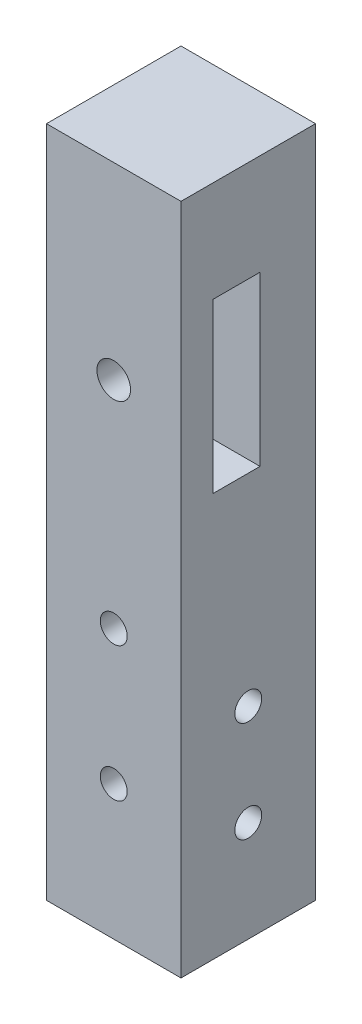
ISO-10303-21;
HEADER;
FILE_DESCRIPTION(('STEP AP214'),'2;1');
FILE_NAME('part.step','',(''),(''),'','','');
FILE_SCHEMA(('AUTOMOTIVE_DESIGN { 1 0 10303 214 1 1 1 1 }'));
ENDSEC;
DATA;
#1=APPLICATION_CONTEXT('core data for automotive mechanical design processes');
#2=APPLICATION_PROTOCOL_DEFINITION('international standard','automotive_design',2000,#1);
#3=PRODUCT_CONTEXT('',#1,'mechanical');
#4=PRODUCT('Part','Part','',(#3));
#5=PRODUCT_RELATED_PRODUCT_CATEGORY('part','',(#4));
#6=PRODUCT_DEFINITION_FORMATION('','',#4);
#7=PRODUCT_DEFINITION_CONTEXT('part definition',#1,'design');
#8=PRODUCT_DEFINITION('design','',#6,#7);
#9=PRODUCT_DEFINITION_SHAPE('','',#8);
#10=(LENGTH_UNIT() NAMED_UNIT(*) SI_UNIT(.MILLI.,.METRE.));
#11=(NAMED_UNIT(*) PLANE_ANGLE_UNIT() SI_UNIT($,.RADIAN.));
#12=(NAMED_UNIT(*) SI_UNIT($,.STERADIAN.) SOLID_ANGLE_UNIT());
#13=UNCERTAINTY_MEASURE_WITH_UNIT(LENGTH_MEASURE(1.E-05),#10,'distance_accuracy_value','');
#14=(GEOMETRIC_REPRESENTATION_CONTEXT(3) GLOBAL_UNCERTAINTY_ASSIGNED_CONTEXT((#13)) GLOBAL_UNIT_ASSIGNED_CONTEXT((#10,
#11,#12)) REPRESENTATION_CONTEXT('',''));
#15=CARTESIAN_POINT('',(0.,0.,0.));
#16=DIRECTION('',(0.,0.,1.));
#17=DIRECTION('',(1.,0.,0.));
#18=AXIS2_PLACEMENT_3D('',#15,#16,#17);
#19=CARTESIAN_POINT('',(-21.5174556213018,28.9526627218935,0.));
#20=DIRECTION('',(0.,0.,1.));
#21=DIRECTION('',(1.,0.,0.));
#22=AXIS2_PLACEMENT_3D('',#19,#20,#21);
#23=CYLINDRICAL_SURFACE('',#22,2.5);
#24=CARTESIAN_POINT('',(-21.5174556213018,28.9526627218935,15.25));
#25=DIRECTION('',(0.,0.,1.));
#26=DIRECTION('',(0.,-1.,0.));
#27=AXIS2_PLACEMENT_3D('',#24,#25,#26);
#28=CIRCLE('',#27,2.5);
#29=CARTESIAN_POINT('',(-21.5174556213018,26.4526627218935,15.25));
#30=VERTEX_POINT('',#29);
#31=EDGE_CURVE('E151',#30,#30,#28,.F.);
#32=ORIENTED_EDGE('',*,*,#31,.T.);
#33=EDGE_LOOP('',(#32));
#34=FACE_BOUND('',#33,.T.);
#35=CARTESIAN_POINT('',(-21.5174556213018,28.9526627218935,20.));
#36=DIRECTION('',(0.,0.,1.));
#37=DIRECTION('',(1.,0.,0.));
#38=AXIS2_PLACEMENT_3D('',#35,#36,#37);
#39=CIRCLE('',#38,2.5);
#40=CARTESIAN_POINT('',(-19.0174556213018,28.9526627218935,20.));
#41=VERTEX_POINT('',#40);
#42=EDGE_CURVE('E174',#41,#41,#39,.T.);
#43=ORIENTED_EDGE('',*,*,#42,.T.);
#44=EDGE_LOOP('',(#43));
#45=FACE_BOUND('',#44,.T.);
#46=ADVANCED_FACE('F44',(#34,#45),#23,.F.);
#47=CARTESIAN_POINT('',(-59.4674556213017,-43.0473372781065,20.));
#48=DIRECTION('',(0.,1.,0.));
#49=DIRECTION('',(0.,0.,1.));
#50=AXIS2_PLACEMENT_3D('',#47,#48,#49);
#51=PLANE('',#50);
#52=DIRECTION('',(1.,0.,0.));
#53=VECTOR('',#52,1.);
#54=CARTESIAN_POINT('',(-59.4674556213017,-43.0473372781065,0.));
#55=LINE('',#54,#53);
#56=CARTESIAN_POINT('',(-31.5174556213018,-43.0473372781065,0.));
#57=VERTEX_POINT('',#56);
#58=CARTESIAN_POINT('',(-11.5174556213018,-43.0473372781065,0.));
#59=VERTEX_POINT('',#58);
#60=EDGE_CURVE('E179',#57,#59,#55,.T.);
#61=ORIENTED_EDGE('',*,*,#60,.T.);
#62=DIRECTION('',(0.,0.,1.));
#63=VECTOR('',#62,1.);
#64=CARTESIAN_POINT('',(-11.5174556213018,-43.0473372781065,0.));
#65=LINE('',#64,#63);
#66=CARTESIAN_POINT('',(-11.5174556213018,-43.0473372781065,20.));
#67=VERTEX_POINT('',#66);
#68=EDGE_CURVE('E160',#59,#67,#65,.T.);
#69=ORIENTED_EDGE('',*,*,#68,.T.);
#70=DIRECTION('',(1.,0.,0.));
#71=VECTOR('',#70,1.);
#72=CARTESIAN_POINT('',(-59.4674556213017,-43.0473372781065,20.));
#73=LINE('',#72,#71);
#74=CARTESIAN_POINT('',(-31.5174556213018,-43.0473372781065,20.));
#75=VERTEX_POINT('',#74);
#76=EDGE_CURVE('E53',#75,#67,#73,.T.);
#77=ORIENTED_EDGE('',*,*,#76,.F.);
#78=DIRECTION('',(0.,0.,1.));
#79=VECTOR('',#78,1.);
#80=CARTESIAN_POINT('',(-31.5174556213018,-43.0473372781065,0.));
#81=LINE('',#80,#79);
#82=EDGE_CURVE('E168',#57,#75,#81,.T.);
#83=ORIENTED_EDGE('',*,*,#82,.F.);
#84=EDGE_LOOP('',(#61,#69,#77,#83));
#85=FACE_BOUND('',#84,.T.);
#86=ADVANCED_FACE('F46',(#85),#51,.F.);
#87=CARTESIAN_POINT('',(-59.4674556213017,56.9526627218935,20.));
#88=DIRECTION('',(0.,-1.,0.));
#89=DIRECTION('',(0.,0.,-1.));
#90=AXIS2_PLACEMENT_3D('',#87,#88,#89);
#91=PLANE('',#90);
#92=DIRECTION('',(-1.,0.,0.));
#93=VECTOR('',#92,1.);
#94=CARTESIAN_POINT('',(-59.4674556213017,56.9526627218935,20.));
#95=LINE('',#94,#93);
#96=CARTESIAN_POINT('',(-11.5174556213018,56.9526627218935,20.));
#97=VERTEX_POINT('',#96);
#98=CARTESIAN_POINT('',(-31.5174556213018,56.9526627218935,20.));
#99=VERTEX_POINT('',#98);
#100=EDGE_CURVE('E13',#97,#99,#95,.T.);
#101=ORIENTED_EDGE('',*,*,#100,.F.);
#102=DIRECTION('',(0.,0.,1.));
#103=VECTOR('',#102,1.);
#104=CARTESIAN_POINT('',(-11.5174556213018,56.9526627218935,0.));
#105=LINE('',#104,#103);
#106=CARTESIAN_POINT('',(-11.5174556213018,56.9526627218935,0.));
#107=VERTEX_POINT('',#106);
#108=EDGE_CURVE('E158',#107,#97,#105,.T.);
#109=ORIENTED_EDGE('',*,*,#108,.F.);
#110=DIRECTION('',(-1.,0.,0.));
#111=VECTOR('',#110,1.);
#112=CARTESIAN_POINT('',(-59.4674556213017,56.9526627218935,0.));
#113=LINE('',#112,#111);
#114=CARTESIAN_POINT('',(-31.5174556213018,56.9526627218935,0.));
#115=VERTEX_POINT('',#114);
#116=EDGE_CURVE('E48',#107,#115,#113,.T.);
#117=ORIENTED_EDGE('',*,*,#116,.T.);
#118=DIRECTION('',(0.,0.,1.));
#119=VECTOR('',#118,1.);
#120=CARTESIAN_POINT('',(-31.5174556213018,56.9526627218935,0.));
#121=LINE('',#120,#119);
#122=EDGE_CURVE('E171',#115,#99,#121,.T.);
#123=ORIENTED_EDGE('',*,*,#122,.T.);
#124=EDGE_LOOP('',(#101,#109,#117,#123));
#125=FACE_BOUND('',#124,.T.);
#126=ADVANCED_FACE('F192',(#125),#91,.F.);
#127=CARTESIAN_POINT('',(0.,0.,20.));
#128=DIRECTION('',(0.,0.,1.));
#129=DIRECTION('',(1.,0.,0.));
#130=AXIS2_PLACEMENT_3D('',#127,#128,#129);
#131=PLANE('',#130);
#132=CARTESIAN_POINT('',(-21.5174556213017,-23.0473372781065,20.));
#133=DIRECTION('',(0.,0.,1.));
#134=DIRECTION('',(1.,0.,0.));
#135=AXIS2_PLACEMENT_3D('',#132,#133,#134);
#136=CIRCLE('',#135,2.);
#137=CARTESIAN_POINT('',(-19.5174556213017,-23.0473372781065,20.));
#138=VERTEX_POINT('',#137);
#139=EDGE_CURVE('E264',#138,#138,#136,.T.);
#140=ORIENTED_EDGE('',*,*,#139,.F.);
#141=EDGE_LOOP('',(#140));
#142=FACE_BOUND('',#141,.T.);
#143=CARTESIAN_POINT('',(-21.5174556213017,-3.04733727810652,20.));
#144=DIRECTION('',(0.,0.,1.));
#145=DIRECTION('',(1.,0.,0.));
#146=AXIS2_PLACEMENT_3D('',#143,#144,#145);
#147=CIRCLE('',#146,2.);
#148=CARTESIAN_POINT('',(-19.5174556213017,-3.04733727810652,20.));
#149=VERTEX_POINT('',#148);
#150=EDGE_CURVE('E273',#149,#149,#147,.T.);
#151=ORIENTED_EDGE('',*,*,#150,.F.);
#152=EDGE_LOOP('',(#151));
#153=FACE_BOUND('',#152,.T.);
#154=DIRECTION('',(0.,-1.,0.));
#155=VECTOR('',#154,1.);
#156=CARTESIAN_POINT('',(-11.5174556213018,56.9526627218935,20.));
#157=LINE('',#156,#155);
#158=EDGE_CURVE('E154',#97,#67,#157,.T.);
#159=ORIENTED_EDGE('',*,*,#158,.F.);
#160=ORIENTED_EDGE('',*,*,#100,.T.);
#161=DIRECTION('',(0.,1.,0.));
#162=VECTOR('',#161,1.);
#163=CARTESIAN_POINT('',(-31.5174556213018,56.9526627218935,20.));
#164=LINE('',#163,#162);
#165=EDGE_CURVE('E163',#75,#99,#164,.T.);
#166=ORIENTED_EDGE('',*,*,#165,.F.);
#167=ORIENTED_EDGE('',*,*,#76,.T.);
#168=EDGE_LOOP('',(#159,#160,#166,#167));
#169=FACE_BOUND('',#168,.T.);
#170=ORIENTED_EDGE('',*,*,#42,.F.);
#171=EDGE_LOOP('',(#170));
#172=FACE_BOUND('',#171,.T.);
#173=ADVANCED_FACE('F201',(#142,#153,#169,#172),#131,.T.);
#174=CARTESIAN_POINT('',(0.,0.,0.));
#175=DIRECTION('',(0.,0.,1.));
#176=DIRECTION('',(1.,0.,0.));
#177=AXIS2_PLACEMENT_3D('',#174,#175,#176);
#178=PLANE('',#177);
#179=CARTESIAN_POINT('',(-21.5174556213017,-23.0473372781065,0.));
#180=DIRECTION('',(0.,0.,1.));
#181=DIRECTION('',(1.,0.,0.));
#182=AXIS2_PLACEMENT_3D('',#179,#180,#181);
#183=CIRCLE('',#182,2.);
#184=CARTESIAN_POINT('',(-19.5174556213017,-23.0473372781065,0.));
#185=VERTEX_POINT('',#184);
#186=EDGE_CURVE('E270',#185,#185,#183,.T.);
#187=ORIENTED_EDGE('',*,*,#186,.T.);
#188=EDGE_LOOP('',(#187));
#189=FACE_BOUND('',#188,.T.);
#190=CARTESIAN_POINT('',(-21.5174556213017,-3.04733727810652,0.));
#191=DIRECTION('',(0.,0.,1.));
#192=DIRECTION('',(1.,0.,0.));
#193=AXIS2_PLACEMENT_3D('',#190,#191,#192);
#194=CIRCLE('',#193,2.);
#195=CARTESIAN_POINT('',(-19.5174556213017,-3.04733727810652,0.));
#196=VERTEX_POINT('',#195);
#197=EDGE_CURVE('E276',#196,#196,#194,.T.);
#198=ORIENTED_EDGE('',*,*,#197,.T.);
#199=EDGE_LOOP('',(#198));
#200=FACE_BOUND('',#199,.T.);
#201=CARTESIAN_POINT('',(-21.5174556213018,28.9526627218935,0.));
#202=DIRECTION('',(0.,0.,1.));
#203=DIRECTION('',(1.,0.,0.));
#204=AXIS2_PLACEMENT_3D('',#201,#202,#203);
#205=CIRCLE('',#204,2.5);
#206=CARTESIAN_POINT('',(-19.0174556213018,28.9526627218935,0.));
#207=VERTEX_POINT('',#206);
#208=EDGE_CURVE('E176',#207,#207,#205,.T.);
#209=ORIENTED_EDGE('',*,*,#208,.T.);
#210=EDGE_LOOP('',(#209));
#211=FACE_BOUND('',#210,.T.);
#212=ORIENTED_EDGE('',*,*,#116,.F.);
#213=DIRECTION('',(0.,-1.,0.));
#214=VECTOR('',#213,1.);
#215=CARTESIAN_POINT('',(-11.5174556213018,56.9526627218935,0.));
#216=LINE('',#215,#214);
#217=EDGE_CURVE('E155',#107,#59,#216,.T.);
#218=ORIENTED_EDGE('',*,*,#217,.T.);
#219=ORIENTED_EDGE('',*,*,#60,.F.);
#220=DIRECTION('',(0.,1.,0.));
#221=VECTOR('',#220,1.);
#222=CARTESIAN_POINT('',(-31.5174556213018,56.9526627218935,0.));
#223=LINE('',#222,#221);
#224=EDGE_CURVE('E165',#57,#115,#223,.T.);
#225=ORIENTED_EDGE('',*,*,#224,.T.);
#226=EDGE_LOOP('',(#212,#218,#219,#225));
#227=FACE_BOUND('',#226,.T.);
#228=ADVANCED_FACE('F197',(#189,#200,#211,#227),#178,.F.);
#229=CARTESIAN_POINT('',(-21.5174556213018,28.9526627218935,8.25));
#230=DIRECTION('',(0.,0.,-1.));
#231=DIRECTION('',(0.,1.,0.));
#232=AXIS2_PLACEMENT_3D('',#229,#230,#231);
#233=CIRCLE('',#232,2.5);
#234=CARTESIAN_POINT('',(-21.5174556213018,31.4526627218935,8.25));
#235=VERTEX_POINT('',#234);
#236=EDGE_CURVE('E142',#235,#235,#233,.F.);
#237=ORIENTED_EDGE('',*,*,#236,.T.);
#238=EDGE_LOOP('',(#237));
#239=FACE_BOUND('',#238,.T.);
#240=ORIENTED_EDGE('',*,*,#208,.F.);
#241=EDGE_LOOP('',(#240));
#242=FACE_BOUND('',#241,.T.);
#243=ADVANCED_FACE('F211',(#239,#242),#23,.F.);
#244=CARTESIAN_POINT('',(-31.5174556213018,56.9526627218935,0.));
#245=DIRECTION('',(1.,0.,0.));
#246=DIRECTION('',(0.,1.,0.));
#247=AXIS2_PLACEMENT_3D('',#244,#245,#246);
#248=PLANE('',#247);
#249=CARTESIAN_POINT('',(-31.5174556213018,-28.0473372781065,10.));
#250=DIRECTION('',(1.,0.,0.));
#251=DIRECTION('',(0.,1.,0.));
#252=AXIS2_PLACEMENT_3D('',#249,#250,#251);
#253=CIRCLE('',#252,2.);
#254=CARTESIAN_POINT('',(-31.5174556213018,-26.0473372781065,10.));
#255=VERTEX_POINT('',#254);
#256=EDGE_CURVE('E261',#255,#255,#253,.T.);
#257=ORIENTED_EDGE('',*,*,#256,.T.);
#258=EDGE_LOOP('',(#257));
#259=FACE_BOUND('',#258,.T.);
#260=CARTESIAN_POINT('',(-31.5174556213018,-13.0473372781065,10.));
#261=DIRECTION('',(1.,0.,0.));
#262=DIRECTION('',(0.,1.,0.));
#263=AXIS2_PLACEMENT_3D('',#260,#261,#262);
#264=CIRCLE('',#263,2.);
#265=CARTESIAN_POINT('',(-31.5174556213018,-11.0473372781065,10.));
#266=VERTEX_POINT('',#265);
#267=EDGE_CURVE('E260',#266,#266,#264,.T.);
#268=ORIENTED_EDGE('',*,*,#267,.T.);
#269=EDGE_LOOP('',(#268));
#270=FACE_BOUND('',#269,.T.);
#271=DIRECTION('',(0.,0.,1.));
#272=VECTOR('',#271,1.);
#273=CARTESIAN_POINT('',(-31.5174556213018,41.9526627218935,0.));
#274=LINE('',#273,#272);
#275=CARTESIAN_POINT('',(-31.5174556213018,41.9526627218935,8.25));
#276=VERTEX_POINT('',#275);
#277=CARTESIAN_POINT('',(-31.5174556213018,41.9526627218935,15.25));
#278=VERTEX_POINT('',#277);
#279=EDGE_CURVE('E145',#276,#278,#274,.T.);
#280=ORIENTED_EDGE('',*,*,#279,.T.);
#281=DIRECTION('',(0.,-1.,0.));
#282=VECTOR('',#281,1.);
#283=CARTESIAN_POINT('',(-31.5174556213018,56.9526627218935,15.25));
#284=LINE('',#283,#282);
#285=CARTESIAN_POINT('',(-31.5174556213018,16.9526627218935,15.25));
#286=VERTEX_POINT('',#285);
#287=EDGE_CURVE('E148',#278,#286,#284,.T.);
#288=ORIENTED_EDGE('',*,*,#287,.T.);
#289=DIRECTION('',(0.,0.,-1.));
#290=VECTOR('',#289,1.);
#291=CARTESIAN_POINT('',(-31.5174556213018,16.9526627218935,0.));
#292=LINE('',#291,#290);
#293=CARTESIAN_POINT('',(-31.5174556213018,16.9526627218935,8.25));
#294=VERTEX_POINT('',#293);
#295=EDGE_CURVE('E137',#286,#294,#292,.T.);
#296=ORIENTED_EDGE('',*,*,#295,.T.);
#297=DIRECTION('',(0.,1.,0.));
#298=VECTOR('',#297,1.);
#299=CARTESIAN_POINT('',(-31.5174556213018,56.9526627218935,8.25));
#300=LINE('',#299,#298);
#301=EDGE_CURVE('E117',#294,#276,#300,.T.);
#302=ORIENTED_EDGE('',*,*,#301,.T.);
#303=EDGE_LOOP('',(#280,#288,#296,#302));
#304=FACE_BOUND('',#303,.T.);
#305=ORIENTED_EDGE('',*,*,#165,.T.);
#306=ORIENTED_EDGE('',*,*,#122,.F.);
#307=ORIENTED_EDGE('',*,*,#224,.F.);
#308=ORIENTED_EDGE('',*,*,#82,.T.);
#309=EDGE_LOOP('',(#305,#306,#307,#308));
#310=FACE_BOUND('',#309,.T.);
#311=ADVANCED_FACE('F195',(#259,#270,#304,#310),#248,.F.);
#312=CARTESIAN_POINT('',(-11.5174556213018,56.9526627218935,0.));
#313=DIRECTION('',(-1.,0.,0.));
#314=DIRECTION('',(0.,-1.,0.));
#315=AXIS2_PLACEMENT_3D('',#312,#313,#314);
#316=PLANE('',#315);
#317=CARTESIAN_POINT('',(-11.5174556213018,-28.0473372781065,10.));
#318=DIRECTION('',(1.,0.,0.));
#319=DIRECTION('',(0.,1.,0.));
#320=AXIS2_PLACEMENT_3D('',#317,#318,#319);
#321=CIRCLE('',#320,2.);
#322=CARTESIAN_POINT('',(-11.5174556213018,-26.0473372781065,10.));
#323=VERTEX_POINT('',#322);
#324=EDGE_CURVE('E255',#323,#323,#321,.T.);
#325=ORIENTED_EDGE('',*,*,#324,.F.);
#326=EDGE_LOOP('',(#325));
#327=FACE_BOUND('',#326,.T.);
#328=CARTESIAN_POINT('',(-11.5174556213018,-13.0473372781065,10.));
#329=DIRECTION('',(1.,0.,0.));
#330=DIRECTION('',(0.,1.,0.));
#331=AXIS2_PLACEMENT_3D('',#328,#329,#330);
#332=CIRCLE('',#331,2.);
#333=CARTESIAN_POINT('',(-11.5174556213018,-11.0473372781065,10.));
#334=VERTEX_POINT('',#333);
#335=EDGE_CURVE('E258',#334,#334,#332,.T.);
#336=ORIENTED_EDGE('',*,*,#335,.F.);
#337=EDGE_LOOP('',(#336));
#338=FACE_BOUND('',#337,.T.);
#339=DIRECTION('',(0.,0.,-1.));
#340=VECTOR('',#339,1.);
#341=CARTESIAN_POINT('',(-11.5174556213018,16.9526627218935,15.25));
#342=LINE('',#341,#340);
#343=CARTESIAN_POINT('',(-11.5174556213018,16.9526627218935,15.25));
#344=VERTEX_POINT('',#343);
#345=CARTESIAN_POINT('',(-11.5174556213018,16.9526627218935,8.25));
#346=VERTEX_POINT('',#345);
#347=EDGE_CURVE('E123',#344,#346,#342,.T.);
#348=ORIENTED_EDGE('',*,*,#347,.F.);
#349=DIRECTION('',(0.,-1.,0.));
#350=VECTOR('',#349,1.);
#351=CARTESIAN_POINT('',(-11.5174556213018,41.9526627218935,15.25));
#352=LINE('',#351,#350);
#353=CARTESIAN_POINT('',(-11.5174556213018,41.9526627218935,15.25));
#354=VERTEX_POINT('',#353);
#355=EDGE_CURVE('E69',#354,#344,#352,.T.);
#356=ORIENTED_EDGE('',*,*,#355,.F.);
#357=DIRECTION('',(0.,0.,1.));
#358=VECTOR('',#357,1.);
#359=CARTESIAN_POINT('',(-11.5174556213018,41.9526627218935,15.25));
#360=LINE('',#359,#358);
#361=CARTESIAN_POINT('',(-11.5174556213018,41.9526627218935,8.25));
#362=VERTEX_POINT('',#361);
#363=EDGE_CURVE('E130',#362,#354,#360,.T.);
#364=ORIENTED_EDGE('',*,*,#363,.F.);
#365=DIRECTION('',(0.,1.,0.));
#366=VECTOR('',#365,1.);
#367=CARTESIAN_POINT('',(-11.5174556213018,41.9526627218935,8.25));
#368=LINE('',#367,#366);
#369=EDGE_CURVE('E114',#346,#362,#368,.T.);
#370=ORIENTED_EDGE('',*,*,#369,.F.);
#371=EDGE_LOOP('',(#348,#356,#364,#370));
#372=FACE_BOUND('',#371,.T.);
#373=ORIENTED_EDGE('',*,*,#158,.T.);
#374=ORIENTED_EDGE('',*,*,#68,.F.);
#375=ORIENTED_EDGE('',*,*,#217,.F.);
#376=ORIENTED_EDGE('',*,*,#108,.T.);
#377=EDGE_LOOP('',(#373,#374,#375,#376));
#378=FACE_BOUND('',#377,.T.);
#379=ADVANCED_FACE('F127',(#327,#338,#372,#378),#316,.F.);
#380=CARTESIAN_POINT('',(-52.5174556213018,41.9526627218935,15.25));
#381=DIRECTION('',(0.,0.,1.));
#382=DIRECTION('',(0.,-1.,0.));
#383=AXIS2_PLACEMENT_3D('',#380,#381,#382);
#384=PLANE('',#383);
#385=DIRECTION('',(1.,0.,0.));
#386=VECTOR('',#385,1.);
#387=CARTESIAN_POINT('',(-52.5174556213018,41.9526627218935,15.25));
#388=LINE('',#387,#386);
#389=EDGE_CURVE('E135',#278,#354,#388,.T.);
#390=ORIENTED_EDGE('',*,*,#389,.T.);
#391=ORIENTED_EDGE('',*,*,#355,.T.);
#392=DIRECTION('',(1.,0.,0.));
#393=VECTOR('',#392,1.);
#394=CARTESIAN_POINT('',(-52.5174556213018,16.9526627218935,15.25));
#395=LINE('',#394,#393);
#396=EDGE_CURVE('E120',#286,#344,#395,.T.);
#397=ORIENTED_EDGE('',*,*,#396,.F.);
#398=ORIENTED_EDGE('',*,*,#287,.F.);
#399=EDGE_LOOP('',(#390,#391,#397,#398));
#400=FACE_BOUND('',#399,.T.);
#401=ORIENTED_EDGE('',*,*,#31,.F.);
#402=EDGE_LOOP('',(#401));
#403=FACE_BOUND('',#402,.T.);
#404=ADVANCED_FACE('F240',(#400,#403),#384,.F.);
#405=CARTESIAN_POINT('',(-52.5174556213018,41.9526627218935,15.25));
#406=DIRECTION('',(0.,1.,0.));
#407=DIRECTION('',(-1.,0.,0.));
#408=AXIS2_PLACEMENT_3D('',#405,#406,#407);
#409=PLANE('',#408);
#410=DIRECTION('',(1.,0.,0.));
#411=VECTOR('',#410,1.);
#412=CARTESIAN_POINT('',(-52.5174556213018,41.9526627218935,8.25));
#413=LINE('',#412,#411);
#414=EDGE_CURVE('E119',#276,#362,#413,.T.);
#415=ORIENTED_EDGE('',*,*,#414,.T.);
#416=ORIENTED_EDGE('',*,*,#363,.T.);
#417=ORIENTED_EDGE('',*,*,#389,.F.);
#418=ORIENTED_EDGE('',*,*,#279,.F.);
#419=EDGE_LOOP('',(#415,#416,#417,#418));
#420=FACE_BOUND('',#419,.T.);
#421=ADVANCED_FACE('F232',(#420),#409,.F.);
#422=CARTESIAN_POINT('',(-52.5174556213018,41.9526627218935,8.25));
#423=DIRECTION('',(0.,0.,-1.));
#424=DIRECTION('',(0.,1.,0.));
#425=AXIS2_PLACEMENT_3D('',#422,#423,#424);
#426=PLANE('',#425);
#427=DIRECTION('',(1.,0.,0.));
#428=VECTOR('',#427,1.);
#429=CARTESIAN_POINT('',(-52.5174556213018,16.9526627218935,8.25));
#430=LINE('',#429,#428);
#431=EDGE_CURVE('E61',#294,#346,#430,.T.);
#432=ORIENTED_EDGE('',*,*,#431,.T.);
#433=ORIENTED_EDGE('',*,*,#369,.T.);
#434=ORIENTED_EDGE('',*,*,#414,.F.);
#435=ORIENTED_EDGE('',*,*,#301,.F.);
#436=EDGE_LOOP('',(#432,#433,#434,#435));
#437=FACE_BOUND('',#436,.T.);
#438=ORIENTED_EDGE('',*,*,#236,.F.);
#439=EDGE_LOOP('',(#438));
#440=FACE_BOUND('',#439,.T.);
#441=ADVANCED_FACE('F110',(#437,#440),#426,.F.);
#442=CARTESIAN_POINT('',(-52.5174556213018,16.9526627218935,15.25));
#443=DIRECTION('',(0.,-1.,0.));
#444=DIRECTION('',(1.,0.,0.));
#445=AXIS2_PLACEMENT_3D('',#442,#443,#444);
#446=PLANE('',#445);
#447=ORIENTED_EDGE('',*,*,#396,.T.);
#448=ORIENTED_EDGE('',*,*,#347,.T.);
#449=ORIENTED_EDGE('',*,*,#431,.F.);
#450=ORIENTED_EDGE('',*,*,#295,.F.);
#451=EDGE_LOOP('',(#447,#448,#449,#450));
#452=FACE_BOUND('',#451,.T.);
#453=ADVANCED_FACE('F124',(#452),#446,.F.);
#454=CARTESIAN_POINT('',(-21.5174556213017,-3.04733727810652,0.));
#455=DIRECTION('',(0.,0.,1.));
#456=DIRECTION('',(1.,0.,0.));
#457=AXIS2_PLACEMENT_3D('',#454,#455,#456);
#458=CYLINDRICAL_SURFACE('',#457,2.);
#459=ORIENTED_EDGE('',*,*,#197,.F.);
#460=EDGE_LOOP('',(#459));
#461=FACE_BOUND('',#460,.T.);
#462=ORIENTED_EDGE('',*,*,#150,.T.);
#463=EDGE_LOOP('',(#462));
#464=FACE_BOUND('',#463,.T.);
#465=ADVANCED_FACE('F238',(#461,#464),#458,.F.);
#466=CARTESIAN_POINT('',(-21.5174556213017,-23.0473372781065,0.));
#467=DIRECTION('',(0.,0.,1.));
#468=DIRECTION('',(1.,0.,0.));
#469=AXIS2_PLACEMENT_3D('',#466,#467,#468);
#470=CYLINDRICAL_SURFACE('',#469,2.);
#471=ORIENTED_EDGE('',*,*,#186,.F.);
#472=EDGE_LOOP('',(#471));
#473=FACE_BOUND('',#472,.T.);
#474=ORIENTED_EDGE('',*,*,#139,.T.);
#475=EDGE_LOOP('',(#474));
#476=FACE_BOUND('',#475,.T.);
#477=ADVANCED_FACE('F284',(#473,#476),#470,.F.);
#478=CARTESIAN_POINT('',(-31.5174556213018,-13.0473372781065,10.));
#479=DIRECTION('',(1.,0.,0.));
#480=DIRECTION('',(0.,1.,0.));
#481=AXIS2_PLACEMENT_3D('',#478,#479,#480);
#482=CYLINDRICAL_SURFACE('',#481,2.);
#483=ORIENTED_EDGE('',*,*,#267,.F.);
#484=EDGE_LOOP('',(#483));
#485=FACE_BOUND('',#484,.T.);
#486=ORIENTED_EDGE('',*,*,#335,.T.);
#487=EDGE_LOOP('',(#486));
#488=FACE_BOUND('',#487,.T.);
#489=ADVANCED_FACE('F289',(#485,#488),#482,.F.);
#490=CARTESIAN_POINT('',(-31.5174556213018,-28.0473372781065,10.));
#491=DIRECTION('',(1.,0.,0.));
#492=DIRECTION('',(0.,1.,0.));
#493=AXIS2_PLACEMENT_3D('',#490,#491,#492);
#494=CYLINDRICAL_SURFACE('',#493,2.);
#495=ORIENTED_EDGE('',*,*,#256,.F.);
#496=EDGE_LOOP('',(#495));
#497=FACE_BOUND('',#496,.T.);
#498=ORIENTED_EDGE('',*,*,#324,.T.);
#499=EDGE_LOOP('',(#498));
#500=FACE_BOUND('',#499,.T.);
#501=ADVANCED_FACE('F296',(#497,#500),#494,.F.);
#502=CLOSED_SHELL('',(#46,#86,#126,#173,#228,#243,#311,#379,#404,#421,#441,#453,#465,#477,#489,#501));
#503=MANIFOLD_SOLID_BREP('B2',#502);
#504=ADVANCED_BREP_SHAPE_REPRESENTATION('',(#18,#503),#14);
#505=SHAPE_DEFINITION_REPRESENTATION(#9,#504);
ENDSEC;
END-ISO-10303-21;
